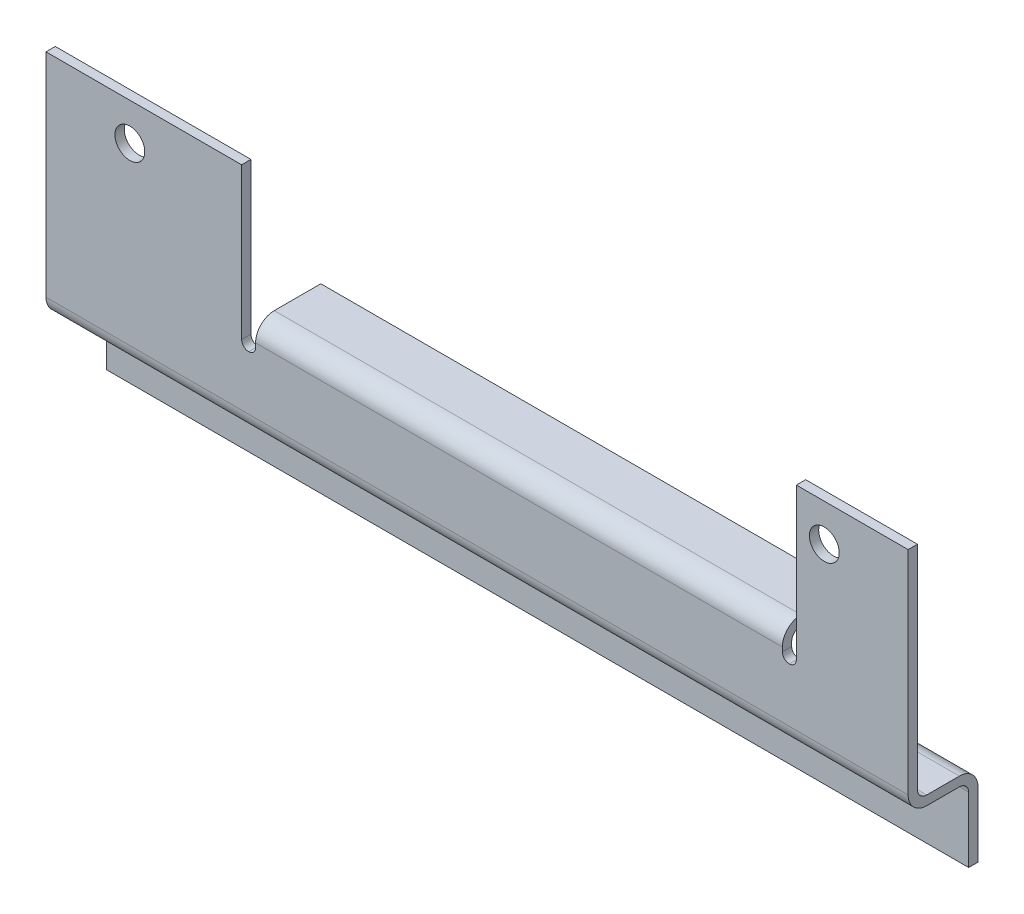
ISO-10303-21;
HEADER;
FILE_DESCRIPTION(('STEP AP214'),'2;1');
FILE_NAME('part.step','',(''),(''),'','','');
FILE_SCHEMA(('AUTOMOTIVE_DESIGN { 1 0 10303 214 1 1 1 1 }'));
ENDSEC;
DATA;
#1=APPLICATION_CONTEXT('core data for automotive mechanical design processes');
#2=APPLICATION_PROTOCOL_DEFINITION('international standard','automotive_design',2000,#1);
#3=PRODUCT_CONTEXT('',#1,'mechanical');
#4=PRODUCT('Part','Part','',(#3));
#5=PRODUCT_RELATED_PRODUCT_CATEGORY('part','',(#4));
#6=PRODUCT_DEFINITION_FORMATION('','',#4);
#7=PRODUCT_DEFINITION_CONTEXT('part definition',#1,'design');
#8=PRODUCT_DEFINITION('design','',#6,#7);
#9=PRODUCT_DEFINITION_SHAPE('','',#8);
#10=(LENGTH_UNIT() NAMED_UNIT(*) SI_UNIT(.MILLI.,.METRE.));
#11=(NAMED_UNIT(*) PLANE_ANGLE_UNIT() SI_UNIT($,.RADIAN.));
#12=(NAMED_UNIT(*) SI_UNIT($,.STERADIAN.) SOLID_ANGLE_UNIT());
#13=UNCERTAINTY_MEASURE_WITH_UNIT(LENGTH_MEASURE(1.E-05),#10,'distance_accuracy_value','');
#14=(GEOMETRIC_REPRESENTATION_CONTEXT(3) GLOBAL_UNCERTAINTY_ASSIGNED_CONTEXT((#13)) GLOBAL_UNIT_ASSIGNED_CONTEXT((#10,
#11,#12)) REPRESENTATION_CONTEXT('',''));
#15=CARTESIAN_POINT('',(0.,0.,0.));
#16=DIRECTION('',(0.,0.,1.));
#17=DIRECTION('',(1.,0.,0.));
#18=AXIS2_PLACEMENT_3D('',#15,#16,#17);
#19=CARTESIAN_POINT('',(46.275,-25.41,1.));
#20=DIRECTION('',(0.,0.,-1.));
#21=DIRECTION('',(-1.,0.,0.));
#22=AXIS2_PLACEMENT_3D('',#19,#20,#21);
#23=PLANE('',#22);
#24=DIRECTION('',(0.,-1.,0.));
#25=VECTOR('',#24,1.);
#26=CARTESIAN_POINT('',(34.275,-25.41,1.));
#27=LINE('',#26,#25);
#28=CARTESIAN_POINT('',(34.275,-25.41,1.));
#29=VERTEX_POINT('',#28);
#30=CARTESIAN_POINT('',(34.275,-41.66,1.));
#31=VERTEX_POINT('',#30);
#32=EDGE_CURVE('E288',#29,#31,#27,.T.);
#33=ORIENTED_EDGE('',*,*,#32,.T.);
#34=CARTESIAN_POINT('',(33.525,-41.66,1.));
#35=DIRECTION('',(0.,0.,-1.));
#36=DIRECTION('',(-1.,0.,0.));
#37=AXIS2_PLACEMENT_3D('',#34,#35,#36);
#38=CIRCLE('',#37,0.75);
#39=CARTESIAN_POINT('',(33.525,-42.41,1.));
#40=VERTEX_POINT('',#39);
#41=EDGE_CURVE('E40',#31,#40,#38,.T.);
#42=ORIENTED_EDGE('',*,*,#41,.T.);
#43=DIRECTION('',(1.,0.,0.));
#44=VECTOR('',#43,1.);
#45=CARTESIAN_POINT('',(32.775,-42.41,1.));
#46=LINE('',#45,#44);
#47=CARTESIAN_POINT('',(33.515,-42.41,1.));
#48=VERTEX_POINT('',#47);
#49=EDGE_CURVE('E236',#48,#40,#46,.T.);
#50=ORIENTED_EDGE('',*,*,#49,.F.);
#51=CARTESIAN_POINT('',(33.515,-41.67,1.));
#52=DIRECTION('',(0.,0.,-1.));
#53=DIRECTION('',(-1.,0.,0.));
#54=AXIS2_PLACEMENT_3D('',#51,#52,#53);
#55=CIRCLE('',#54,0.74);
#56=CARTESIAN_POINT('',(32.775,-41.67,1.));
#57=VERTEX_POINT('',#56);
#58=EDGE_CURVE('E235',#48,#57,#55,.T.);
#59=ORIENTED_EDGE('',*,*,#58,.T.);
#60=DIRECTION('',(0.,-1.,0.));
#61=VECTOR('',#60,1.);
#62=CARTESIAN_POINT('',(32.775,-25.41,1.));
#63=LINE('',#62,#61);
#64=CARTESIAN_POINT('',(32.775,-41.22,1.));
#65=VERTEX_POINT('',#64);
#66=EDGE_CURVE('E219',#65,#57,#63,.T.);
#67=ORIENTED_EDGE('',*,*,#66,.F.);
#68=DIRECTION('',(-1.,0.,0.));
#69=VECTOR('',#68,1.);
#70=CARTESIAN_POINT('',(46.275,-41.22,1.));
#71=LINE('',#70,#69);
#72=CARTESIAN_POINT('',(-23.775,-41.22,1.));
#73=VERTEX_POINT('',#72);
#74=EDGE_CURVE('E233',#65,#73,#71,.T.);
#75=ORIENTED_EDGE('',*,*,#74,.T.);
#76=DIRECTION('',(0.,1.,0.));
#77=VECTOR('',#76,1.);
#78=CARTESIAN_POINT('',(-23.775,-25.41,1.));
#79=LINE('',#78,#77);
#80=CARTESIAN_POINT('',(-23.775,-41.67,1.));
#81=VERTEX_POINT('',#80);
#82=EDGE_CURVE('E570',#81,#73,#79,.T.);
#83=ORIENTED_EDGE('',*,*,#82,.F.);
#84=CARTESIAN_POINT('',(-24.515,-41.67,1.));
#85=DIRECTION('',(0.,0.,-1.));
#86=DIRECTION('',(-1.,0.,0.));
#87=AXIS2_PLACEMENT_3D('',#84,#85,#86);
#88=CIRCLE('',#87,0.74);
#89=CARTESIAN_POINT('',(-24.515,-42.41,1.));
#90=VERTEX_POINT('',#89);
#91=EDGE_CURVE('E267',#81,#90,#88,.T.);
#92=ORIENTED_EDGE('',*,*,#91,.T.);
#93=DIRECTION('',(1.,0.,0.));
#94=VECTOR('',#93,1.);
#95=CARTESIAN_POINT('',(-25.275,-42.41,1.));
#96=LINE('',#95,#94);
#97=CARTESIAN_POINT('',(-24.525,-42.41,1.));
#98=VERTEX_POINT('',#97);
#99=EDGE_CURVE('E566',#98,#90,#96,.T.);
#100=ORIENTED_EDGE('',*,*,#99,.F.);
#101=CARTESIAN_POINT('',(-24.525,-41.66,1.));
#102=DIRECTION('',(0.,0.,-1.));
#103=DIRECTION('',(-1.,0.,0.));
#104=AXIS2_PLACEMENT_3D('',#101,#102,#103);
#105=CIRCLE('',#104,0.75);
#106=CARTESIAN_POINT('',(-25.275,-41.66,1.));
#107=VERTEX_POINT('',#106);
#108=EDGE_CURVE('E257',#98,#107,#105,.T.);
#109=ORIENTED_EDGE('',*,*,#108,.T.);
#110=DIRECTION('',(0.,1.,0.));
#111=VECTOR('',#110,1.);
#112=CARTESIAN_POINT('',(-25.275,-25.41,1.));
#113=LINE('',#112,#111);
#114=CARTESIAN_POINT('',(-25.275,-25.41,1.));
#115=VERTEX_POINT('',#114);
#116=EDGE_CURVE('E296',#107,#115,#113,.T.);
#117=ORIENTED_EDGE('',*,*,#116,.T.);
#118=DIRECTION('',(-1.,0.,0.));
#119=VECTOR('',#118,1.);
#120=CARTESIAN_POINT('',(-46.275,-25.41,1.));
#121=LINE('',#120,#119);
#122=CARTESIAN_POINT('',(-46.275,-25.41,1.));
#123=VERTEX_POINT('',#122);
#124=EDGE_CURVE('E298',#115,#123,#121,.T.);
#125=ORIENTED_EDGE('',*,*,#124,.T.);
#126=DIRECTION('',(0.,-1.,0.));
#127=VECTOR('',#126,1.);
#128=CARTESIAN_POINT('',(-46.275,-25.41,1.));
#129=LINE('',#128,#127);
#130=CARTESIAN_POINT('',(-46.275,-48.22,1.));
#131=VERTEX_POINT('',#130);
#132=EDGE_CURVE('E305',#123,#131,#129,.T.);
#133=ORIENTED_EDGE('',*,*,#132,.T.);
#134=DIRECTION('',(1.,0.,0.));
#135=VECTOR('',#134,1.);
#136=CARTESIAN_POINT('',(46.275,-48.22,1.));
#137=LINE('',#136,#135);
#138=CARTESIAN_POINT('',(46.275,-48.22,1.));
#139=VERTEX_POINT('',#138);
#140=EDGE_CURVE('E424',#131,#139,#137,.T.);
#141=ORIENTED_EDGE('',*,*,#140,.T.);
#142=DIRECTION('',(0.,1.,0.));
#143=VECTOR('',#142,1.);
#144=CARTESIAN_POINT('',(46.275,-25.41,1.));
#145=LINE('',#144,#143);
#146=CARTESIAN_POINT('',(46.275,-25.41,1.));
#147=VERTEX_POINT('',#146);
#148=EDGE_CURVE('E308',#139,#147,#145,.T.);
#149=ORIENTED_EDGE('',*,*,#148,.T.);
#150=DIRECTION('',(-1.,0.,0.));
#151=VECTOR('',#150,1.);
#152=CARTESIAN_POINT('',(34.275,-25.41,1.));
#153=LINE('',#152,#151);
#154=EDGE_CURVE('E294',#147,#29,#153,.T.);
#155=ORIENTED_EDGE('',*,*,#154,.T.);
#156=EDGE_LOOP('',(#33,#42,#50,#59,#67,#75,#83,#92,#100,#109,#117,#125,#133,#141,#149,#155));
#157=FACE_BOUND('',#156,.T.);
#158=CARTESIAN_POINT('',(37.275,-29.41,1.));
#159=DIRECTION('',(0.,0.,1.));
#160=DIRECTION('',(1.,0.,0.));
#161=AXIS2_PLACEMENT_3D('',#158,#159,#160);
#162=CIRCLE('',#161,1.6);
#163=CARTESIAN_POINT('',(38.875,-29.41,1.));
#164=VERTEX_POINT('',#163);
#165=EDGE_CURVE('E487',#164,#164,#162,.T.);
#166=ORIENTED_EDGE('',*,*,#165,.F.);
#167=EDGE_LOOP('',(#166));
#168=FACE_BOUND('',#167,.T.);
#169=CARTESIAN_POINT('',(-37.275,-29.41,1.));
#170=DIRECTION('',(0.,0.,1.));
#171=DIRECTION('',(1.,0.,0.));
#172=AXIS2_PLACEMENT_3D('',#169,#170,#171);
#173=CIRCLE('',#172,1.6);
#174=CARTESIAN_POINT('',(-35.675,-29.41,1.));
#175=VERTEX_POINT('',#174);
#176=EDGE_CURVE('E589',#175,#175,#173,.T.);
#177=ORIENTED_EDGE('',*,*,#176,.F.);
#178=EDGE_LOOP('',(#177));
#179=FACE_BOUND('',#178,.T.);
#180=ADVANCED_FACE('F32',(#157,#168,#179),#23,.F.);
#181=CARTESIAN_POINT('',(46.275,-25.41,0.));
#182=DIRECTION('',(0.,0.,-1.));
#183=DIRECTION('',(-1.,0.,0.));
#184=AXIS2_PLACEMENT_3D('',#181,#182,#183);
#185=PLANE('',#184);
#186=DIRECTION('',(-1.,0.,0.));
#187=VECTOR('',#186,1.);
#188=CARTESIAN_POINT('',(46.275,-42.41,0.));
#189=LINE('',#188,#187);
#190=CARTESIAN_POINT('',(33.525,-42.41,0.));
#191=VERTEX_POINT('',#190);
#192=CARTESIAN_POINT('',(33.515,-42.41,0.));
#193=VERTEX_POINT('',#192);
#194=EDGE_CURVE('E227',#191,#193,#189,.T.);
#195=ORIENTED_EDGE('',*,*,#194,.F.);
#196=CARTESIAN_POINT('',(33.525,-41.66,0.));
#197=DIRECTION('',(0.,0.,-1.));
#198=DIRECTION('',(-1.,0.,0.));
#199=AXIS2_PLACEMENT_3D('',#196,#197,#198);
#200=CIRCLE('',#199,0.75);
#201=CARTESIAN_POINT('',(34.275,-41.66,0.));
#202=VERTEX_POINT('',#201);
#203=EDGE_CURVE('E11',#191,#202,#200,.F.);
#204=ORIENTED_EDGE('',*,*,#203,.T.);
#205=DIRECTION('',(0.,-1.,0.));
#206=VECTOR('',#205,1.);
#207=CARTESIAN_POINT('',(34.275,-25.41,0.));
#208=LINE('',#207,#206);
#209=CARTESIAN_POINT('',(34.275,-25.41,0.));
#210=VERTEX_POINT('',#209);
#211=EDGE_CURVE('E290',#210,#202,#208,.T.);
#212=ORIENTED_EDGE('',*,*,#211,.F.);
#213=DIRECTION('',(-1.,0.,0.));
#214=VECTOR('',#213,1.);
#215=CARTESIAN_POINT('',(34.275,-25.41,0.));
#216=LINE('',#215,#214);
#217=CARTESIAN_POINT('',(46.275,-25.41,0.));
#218=VERTEX_POINT('',#217);
#219=EDGE_CURVE('E485',#218,#210,#216,.T.);
#220=ORIENTED_EDGE('',*,*,#219,.F.);
#221=DIRECTION('',(0.,1.,0.));
#222=VECTOR('',#221,1.);
#223=CARTESIAN_POINT('',(46.275,-25.41,0.));
#224=LINE('',#223,#222);
#225=CARTESIAN_POINT('',(46.275,-48.22,0.));
#226=VERTEX_POINT('',#225);
#227=EDGE_CURVE('E300',#226,#218,#224,.T.);
#228=ORIENTED_EDGE('',*,*,#227,.F.);
#229=DIRECTION('',(1.,0.,0.));
#230=VECTOR('',#229,1.);
#231=CARTESIAN_POINT('',(-46.275,-48.22,0.));
#232=LINE('',#231,#230);
#233=CARTESIAN_POINT('',(-46.275,-48.22,0.));
#234=VERTEX_POINT('',#233);
#235=EDGE_CURVE('E331',#226,#234,#232,.F.);
#236=ORIENTED_EDGE('',*,*,#235,.T.);
#237=DIRECTION('',(0.,-1.,0.));
#238=VECTOR('',#237,1.);
#239=CARTESIAN_POINT('',(-46.275,-25.41,0.));
#240=LINE('',#239,#238);
#241=CARTESIAN_POINT('',(-46.275,-25.41,0.));
#242=VERTEX_POINT('',#241);
#243=EDGE_CURVE('E324',#242,#234,#240,.T.);
#244=ORIENTED_EDGE('',*,*,#243,.F.);
#245=DIRECTION('',(-1.,0.,0.));
#246=VECTOR('',#245,1.);
#247=CARTESIAN_POINT('',(-46.275,-25.41,0.));
#248=LINE('',#247,#246);
#249=CARTESIAN_POINT('',(-25.275,-25.41,0.));
#250=VERTEX_POINT('',#249);
#251=EDGE_CURVE('E496',#250,#242,#248,.T.);
#252=ORIENTED_EDGE('',*,*,#251,.F.);
#253=DIRECTION('',(0.,1.,0.));
#254=VECTOR('',#253,1.);
#255=CARTESIAN_POINT('',(-25.275,-25.41,0.));
#256=LINE('',#255,#254);
#257=CARTESIAN_POINT('',(-25.275,-41.66,0.));
#258=VERTEX_POINT('',#257);
#259=EDGE_CURVE('E489',#258,#250,#256,.T.);
#260=ORIENTED_EDGE('',*,*,#259,.F.);
#261=CARTESIAN_POINT('',(-24.525,-41.66,0.));
#262=DIRECTION('',(0.,0.,-1.));
#263=DIRECTION('',(-1.,0.,0.));
#264=AXIS2_PLACEMENT_3D('',#261,#262,#263);
#265=CIRCLE('',#264,0.75);
#266=CARTESIAN_POINT('',(-24.525,-42.41,0.));
#267=VERTEX_POINT('',#266);
#268=EDGE_CURVE('E259',#258,#267,#265,.F.);
#269=ORIENTED_EDGE('',*,*,#268,.T.);
#270=DIRECTION('',(-1.,0.,0.));
#271=VECTOR('',#270,1.);
#272=CARTESIAN_POINT('',(46.275,-42.41,0.));
#273=LINE('',#272,#271);
#274=CARTESIAN_POINT('',(-24.515,-42.41,0.));
#275=VERTEX_POINT('',#274);
#276=EDGE_CURVE('E228',#275,#267,#273,.T.);
#277=ORIENTED_EDGE('',*,*,#276,.F.);
#278=CARTESIAN_POINT('',(-24.515,-41.67,0.));
#279=DIRECTION('',(0.,0.,-1.));
#280=DIRECTION('',(-1.,0.,0.));
#281=AXIS2_PLACEMENT_3D('',#278,#279,#280);
#282=CIRCLE('',#281,0.74);
#283=CARTESIAN_POINT('',(-23.775,-41.67,0.));
#284=VERTEX_POINT('',#283);
#285=EDGE_CURVE('E269',#275,#284,#282,.F.);
#286=ORIENTED_EDGE('',*,*,#285,.T.);
#287=DIRECTION('',(0.,-1.,0.));
#288=VECTOR('',#287,1.);
#289=CARTESIAN_POINT('',(-23.775,-25.41,0.));
#290=LINE('',#289,#288);
#291=CARTESIAN_POINT('',(-23.775,-41.22,0.));
#292=VERTEX_POINT('',#291);
#293=EDGE_CURVE('E457',#292,#284,#290,.T.);
#294=ORIENTED_EDGE('',*,*,#293,.F.);
#295=DIRECTION('',(-1.,0.,0.));
#296=VECTOR('',#295,1.);
#297=CARTESIAN_POINT('',(34.275,-41.22,0.));
#298=LINE('',#297,#296);
#299=CARTESIAN_POINT('',(32.775,-41.22,0.));
#300=VERTEX_POINT('',#299);
#301=EDGE_CURVE('E241',#292,#300,#298,.F.);
#302=ORIENTED_EDGE('',*,*,#301,.T.);
#303=DIRECTION('',(0.,1.,0.));
#304=VECTOR('',#303,1.);
#305=CARTESIAN_POINT('',(32.775,-25.41,0.));
#306=LINE('',#305,#304);
#307=CARTESIAN_POINT('',(32.775,-41.67,0.));
#308=VERTEX_POINT('',#307);
#309=EDGE_CURVE('E565',#308,#300,#306,.T.);
#310=ORIENTED_EDGE('',*,*,#309,.F.);
#311=CARTESIAN_POINT('',(33.515,-41.67,0.));
#312=DIRECTION('',(0.,0.,-1.));
#313=DIRECTION('',(-1.,0.,0.));
#314=AXIS2_PLACEMENT_3D('',#311,#312,#313);
#315=CIRCLE('',#314,0.74);
#316=EDGE_CURVE('E277',#308,#193,#315,.F.);
#317=ORIENTED_EDGE('',*,*,#316,.T.);
#318=EDGE_LOOP('',(#195,#204,#212,#220,#228,#236,#244,#252,#260,#269,#277,#286,#294,#302,#310,#317));
#319=FACE_BOUND('',#318,.T.);
#320=CARTESIAN_POINT('',(37.275,-29.41,0.));
#321=DIRECTION('',(0.,0.,1.));
#322=DIRECTION('',(1.,0.,0.));
#323=AXIS2_PLACEMENT_3D('',#320,#321,#322);
#324=CIRCLE('',#323,1.6);
#325=CARTESIAN_POINT('',(38.875,-29.41,0.));
#326=VERTEX_POINT('',#325);
#327=EDGE_CURVE('E492',#326,#326,#324,.T.);
#328=ORIENTED_EDGE('',*,*,#327,.T.);
#329=EDGE_LOOP('',(#328));
#330=FACE_BOUND('',#329,.T.);
#331=CARTESIAN_POINT('',(-37.275,-29.41,0.));
#332=DIRECTION('',(0.,0.,1.));
#333=DIRECTION('',(1.,0.,0.));
#334=AXIS2_PLACEMENT_3D('',#331,#332,#333);
#335=CIRCLE('',#334,1.6);
#336=CARTESIAN_POINT('',(-35.675,-29.41,0.));
#337=VERTEX_POINT('',#336);
#338=EDGE_CURVE('E584',#337,#337,#335,.T.);
#339=ORIENTED_EDGE('',*,*,#338,.T.);
#340=EDGE_LOOP('',(#339));
#341=FACE_BOUND('',#340,.T.);
#342=ADVANCED_FACE('F482',(#319,#330,#341),#185,.T.);
#343=CARTESIAN_POINT('',(34.275,-25.41,1.));
#344=DIRECTION('',(0.,-1.,0.));
#345=DIRECTION('',(0.,0.,-1.));
#346=AXIS2_PLACEMENT_3D('',#343,#344,#345);
#347=PLANE('',#346);
#348=ORIENTED_EDGE('',*,*,#219,.T.);
#349=DIRECTION('',(0.,0.,-1.));
#350=VECTOR('',#349,1.);
#351=CARTESIAN_POINT('',(34.275,-25.41,1.));
#352=LINE('',#351,#350);
#353=EDGE_CURVE('E319',#29,#210,#352,.T.);
#354=ORIENTED_EDGE('',*,*,#353,.F.);
#355=ORIENTED_EDGE('',*,*,#154,.F.);
#356=DIRECTION('',(0.,0.,-1.));
#357=VECTOR('',#356,1.);
#358=CARTESIAN_POINT('',(46.275,-25.41,1.));
#359=LINE('',#358,#357);
#360=EDGE_CURVE('E310',#147,#218,#359,.T.);
#361=ORIENTED_EDGE('',*,*,#360,.T.);
#362=EDGE_LOOP('',(#348,#354,#355,#361));
#363=FACE_BOUND('',#362,.T.);
#364=ADVANCED_FACE('F526',(#363),#347,.F.);
#365=CARTESIAN_POINT('',(34.275,-25.41,1.));
#366=DIRECTION('',(1.,0.,0.));
#367=DIRECTION('',(0.,1.,0.));
#368=AXIS2_PLACEMENT_3D('',#365,#366,#367);
#369=PLANE('',#368);
#370=ORIENTED_EDGE('',*,*,#211,.T.);
#371=DIRECTION('',(0.,0.,1.));
#372=VECTOR('',#371,1.);
#373=CARTESIAN_POINT('',(34.275,-41.66,1.));
#374=LINE('',#373,#372);
#375=EDGE_CURVE('E280',#202,#31,#374,.T.);
#376=ORIENTED_EDGE('',*,*,#375,.T.);
#377=ORIENTED_EDGE('',*,*,#32,.F.);
#378=ORIENTED_EDGE('',*,*,#353,.T.);
#379=EDGE_LOOP('',(#370,#376,#377,#378));
#380=FACE_BOUND('',#379,.T.);
#381=ADVANCED_FACE('F286',(#380),#369,.F.);
#382=CARTESIAN_POINT('',(-25.275,-39.22,1.));
#383=DIRECTION('',(0.,-1.,0.));
#384=DIRECTION('',(0.,0.,-1.));
#385=AXIS2_PLACEMENT_3D('',#382,#383,#384);
#386=PLANE('',#385);
#387=DIRECTION('',(-1.,0.,0.));
#388=VECTOR('',#387,1.);
#389=CARTESIAN_POINT('',(-25.275,-39.22,-1.));
#390=LINE('',#389,#388);
#391=CARTESIAN_POINT('',(-23.775,-39.22,-1.));
#392=VERTEX_POINT('',#391);
#393=CARTESIAN_POINT('',(32.775,-39.22,-1.));
#394=VERTEX_POINT('',#393);
#395=EDGE_CURVE('E240',#392,#394,#390,.F.);
#396=ORIENTED_EDGE('',*,*,#395,.T.);
#397=DIRECTION('',(0.,0.,-1.));
#398=VECTOR('',#397,1.);
#399=CARTESIAN_POINT('',(32.775,-39.22,1.));
#400=LINE('',#399,#398);
#401=CARTESIAN_POINT('',(32.775,-39.22,-6.));
#402=VERTEX_POINT('',#401);
#403=EDGE_CURVE('E222',#394,#402,#400,.T.);
#404=ORIENTED_EDGE('',*,*,#403,.T.);
#405=DIRECTION('',(-1.,0.,0.));
#406=VECTOR('',#405,1.);
#407=CARTESIAN_POINT('',(-25.275,-39.22,-6.));
#408=LINE('',#407,#406);
#409=CARTESIAN_POINT('',(-23.775,-39.22,-6.));
#410=VERTEX_POINT('',#409);
#411=EDGE_CURVE('E582',#402,#410,#408,.T.);
#412=ORIENTED_EDGE('',*,*,#411,.T.);
#413=DIRECTION('',(0.,0.,1.));
#414=VECTOR('',#413,1.);
#415=CARTESIAN_POINT('',(-23.775,-39.22,1.));
#416=LINE('',#415,#414);
#417=EDGE_CURVE('E576',#410,#392,#416,.T.);
#418=ORIENTED_EDGE('',*,*,#417,.T.);
#419=EDGE_LOOP('',(#396,#404,#412,#418));
#420=FACE_BOUND('',#419,.T.);
#421=ADVANCED_FACE('F540',(#420),#386,.F.);
#422=CARTESIAN_POINT('',(-25.275,-25.41,1.));
#423=DIRECTION('',(-1.,0.,0.));
#424=DIRECTION('',(0.,-1.,0.));
#425=AXIS2_PLACEMENT_3D('',#422,#423,#424);
#426=PLANE('',#425);
#427=ORIENTED_EDGE('',*,*,#116,.F.);
#428=DIRECTION('',(0.,0.,1.));
#429=VECTOR('',#428,1.);
#430=CARTESIAN_POINT('',(-25.275,-41.66,0.));
#431=LINE('',#430,#429);
#432=EDGE_CURVE('E255',#107,#258,#431,.F.);
#433=ORIENTED_EDGE('',*,*,#432,.T.);
#434=ORIENTED_EDGE('',*,*,#259,.T.);
#435=DIRECTION('',(0.,0.,-1.));
#436=VECTOR('',#435,1.);
#437=CARTESIAN_POINT('',(-25.275,-25.41,1.));
#438=LINE('',#437,#436);
#439=EDGE_CURVE('E316',#115,#250,#438,.T.);
#440=ORIENTED_EDGE('',*,*,#439,.F.);
#441=EDGE_LOOP('',(#427,#433,#434,#440));
#442=FACE_BOUND('',#441,.T.);
#443=ADVANCED_FACE('F537',(#442),#426,.F.);
#444=CARTESIAN_POINT('',(-46.275,-25.41,1.));
#445=DIRECTION('',(0.,-1.,0.));
#446=DIRECTION('',(0.,0.,-1.));
#447=AXIS2_PLACEMENT_3D('',#444,#445,#446);
#448=PLANE('',#447);
#449=ORIENTED_EDGE('',*,*,#251,.T.);
#450=DIRECTION('',(0.,0.,-1.));
#451=VECTOR('',#450,1.);
#452=CARTESIAN_POINT('',(-46.275,-25.41,1.));
#453=LINE('',#452,#451);
#454=EDGE_CURVE('E313',#123,#242,#453,.T.);
#455=ORIENTED_EDGE('',*,*,#454,.F.);
#456=ORIENTED_EDGE('',*,*,#124,.F.);
#457=ORIENTED_EDGE('',*,*,#439,.T.);
#458=EDGE_LOOP('',(#449,#455,#456,#457));
#459=FACE_BOUND('',#458,.T.);
#460=ADVANCED_FACE('F500',(#459),#448,.F.);
#461=CARTESIAN_POINT('',(-46.275,-25.41,1.));
#462=DIRECTION('',(1.,0.,0.));
#463=DIRECTION('',(0.,0.,-1.));
#464=AXIS2_PLACEMENT_3D('',#461,#462,#463);
#465=PLANE('',#464);
#466=DIRECTION('',(0.,0.,1.));
#467=VECTOR('',#466,1.);
#468=CARTESIAN_POINT('',(-46.275,-49.22,-6.5));
#469=LINE('',#468,#467);
#470=CARTESIAN_POINT('',(-46.275,-49.22,-4.5));
#471=VERTEX_POINT('',#470);
#472=CARTESIAN_POINT('',(-46.275,-49.22,-1.));
#473=VERTEX_POINT('',#472);
#474=EDGE_CURVE('E343',#471,#473,#469,.T.);
#475=ORIENTED_EDGE('',*,*,#474,.F.);
#476=CARTESIAN_POINT('',(-46.275,-51.22,-4.5));
#477=DIRECTION('',(1.,0.,0.));
#478=DIRECTION('',(0.,0.,-1.));
#479=AXIS2_PLACEMENT_3D('',#476,#477,#478);
#480=CIRCLE('',#479,2.);
#481=CARTESIAN_POINT('',(-46.275,-51.22,-6.5));
#482=VERTEX_POINT('',#481);
#483=EDGE_CURVE('E464',#471,#482,#480,.F.);
#484=ORIENTED_EDGE('',*,*,#483,.T.);
#485=DIRECTION('',(0.,-1.,0.));
#486=VECTOR('',#485,1.);
#487=CARTESIAN_POINT('',(-46.275,-49.22,-6.5));
#488=LINE('',#487,#486);
#489=CARTESIAN_POINT('',(-46.275,-58.22,-6.5));
#490=VERTEX_POINT('',#489);
#491=EDGE_CURVE('E395',#482,#490,#488,.T.);
#492=ORIENTED_EDGE('',*,*,#491,.T.);
#493=DIRECTION('',(0.,0.,-1.));
#494=VECTOR('',#493,1.);
#495=CARTESIAN_POINT('',(-46.275,-58.22,-6.5));
#496=LINE('',#495,#494);
#497=CARTESIAN_POINT('',(-46.275,-58.22,-5.5));
#498=VERTEX_POINT('',#497);
#499=EDGE_CURVE('E392',#498,#490,#496,.T.);
#500=ORIENTED_EDGE('',*,*,#499,.F.);
#501=DIRECTION('',(0.,1.,0.));
#502=VECTOR('',#501,1.);
#503=CARTESIAN_POINT('',(-46.275,-58.22,-5.5));
#504=LINE('',#503,#502);
#505=CARTESIAN_POINT('',(-46.275,-51.22,-5.5));
#506=VERTEX_POINT('',#505);
#507=EDGE_CURVE('E382',#498,#506,#504,.T.);
#508=ORIENTED_EDGE('',*,*,#507,.T.);
#509=CARTESIAN_POINT('',(-46.275,-51.22,-4.5));
#510=DIRECTION('',(1.,0.,0.));
#511=DIRECTION('',(0.,0.,-1.));
#512=AXIS2_PLACEMENT_3D('',#509,#510,#511);
#513=CIRCLE('',#512,1.);
#514=CARTESIAN_POINT('',(-46.275,-50.22,-4.5));
#515=VERTEX_POINT('',#514);
#516=EDGE_CURVE('E333',#506,#515,#513,.T.);
#517=ORIENTED_EDGE('',*,*,#516,.T.);
#518=DIRECTION('',(0.,0.,1.));
#519=VECTOR('',#518,1.);
#520=CARTESIAN_POINT('',(-46.275,-50.22,-6.5));
#521=LINE('',#520,#519);
#522=CARTESIAN_POINT('',(-46.275,-50.22,-1.));
#523=VERTEX_POINT('',#522);
#524=EDGE_CURVE('E365',#515,#523,#521,.T.);
#525=ORIENTED_EDGE('',*,*,#524,.T.);
#526=CARTESIAN_POINT('',(-46.275,-48.22,-1.));
#527=DIRECTION('',(1.,0.,0.));
#528=DIRECTION('',(0.,0.,-1.));
#529=AXIS2_PLACEMENT_3D('',#526,#527,#528);
#530=CIRCLE('',#529,2.);
#531=EDGE_CURVE('E465',#523,#131,#530,.F.);
#532=ORIENTED_EDGE('',*,*,#531,.T.);
#533=ORIENTED_EDGE('',*,*,#132,.F.);
#534=ORIENTED_EDGE('',*,*,#454,.T.);
#535=ORIENTED_EDGE('',*,*,#243,.T.);
#536=CARTESIAN_POINT('',(-46.275,-48.22,-1.));
#537=DIRECTION('',(1.,0.,0.));
#538=DIRECTION('',(0.,0.,-1.));
#539=AXIS2_PLACEMENT_3D('',#536,#537,#538);
#540=CIRCLE('',#539,1.);
#541=EDGE_CURVE('E339',#234,#473,#540,.T.);
#542=ORIENTED_EDGE('',*,*,#541,.T.);
#543=EDGE_LOOP('',(#475,#484,#492,#500,#508,#517,#525,#532,#533,#534,#535,#542));
#544=FACE_BOUND('',#543,.T.);
#545=ADVANCED_FACE('F390',(#544),#465,.F.);
#546=CARTESIAN_POINT('',(46.275,-25.41,1.));
#547=DIRECTION('',(-1.,0.,0.));
#548=DIRECTION('',(0.,0.,1.));
#549=AXIS2_PLACEMENT_3D('',#546,#547,#548);
#550=PLANE('',#549);
#551=DIRECTION('',(0.,1.,0.));
#552=VECTOR('',#551,1.);
#553=CARTESIAN_POINT('',(46.275,-49.22,-6.5));
#554=LINE('',#553,#552);
#555=CARTESIAN_POINT('',(46.275,-58.22,-6.5));
#556=VERTEX_POINT('',#555);
#557=CARTESIAN_POINT('',(46.275,-51.22,-6.5));
#558=VERTEX_POINT('',#557);
#559=EDGE_CURVE('E352',#556,#558,#554,.T.);
#560=ORIENTED_EDGE('',*,*,#559,.T.);
#561=CARTESIAN_POINT('',(46.275,-51.22,-4.5));
#562=DIRECTION('',(-1.,0.,0.));
#563=DIRECTION('',(0.,0.,1.));
#564=AXIS2_PLACEMENT_3D('',#561,#562,#563);
#565=CIRCLE('',#564,2.);
#566=CARTESIAN_POINT('',(46.275,-49.22,-4.5));
#567=VERTEX_POINT('',#566);
#568=EDGE_CURVE('E414',#558,#567,#565,.F.);
#569=ORIENTED_EDGE('',*,*,#568,.T.);
#570=DIRECTION('',(0.,0.,1.));
#571=VECTOR('',#570,1.);
#572=CARTESIAN_POINT('',(46.275,-49.22,-6.5));
#573=LINE('',#572,#571);
#574=CARTESIAN_POINT('',(46.275,-49.22,-1.));
#575=VERTEX_POINT('',#574);
#576=EDGE_CURVE('E347',#567,#575,#573,.T.);
#577=ORIENTED_EDGE('',*,*,#576,.T.);
#578=CARTESIAN_POINT('',(46.275,-48.22,-1.));
#579=DIRECTION('',(-1.,0.,0.));
#580=DIRECTION('',(0.,0.,1.));
#581=AXIS2_PLACEMENT_3D('',#578,#579,#580);
#582=CIRCLE('',#581,1.);
#583=EDGE_CURVE('E337',#575,#226,#582,.T.);
#584=ORIENTED_EDGE('',*,*,#583,.T.);
#585=ORIENTED_EDGE('',*,*,#227,.T.);
#586=ORIENTED_EDGE('',*,*,#360,.F.);
#587=ORIENTED_EDGE('',*,*,#148,.F.);
#588=CARTESIAN_POINT('',(46.275,-48.22,-1.));
#589=DIRECTION('',(-1.,0.,0.));
#590=DIRECTION('',(0.,0.,1.));
#591=AXIS2_PLACEMENT_3D('',#588,#589,#590);
#592=CIRCLE('',#591,2.);
#593=CARTESIAN_POINT('',(46.275,-50.22,-1.));
#594=VERTEX_POINT('',#593);
#595=EDGE_CURVE('E425',#139,#594,#592,.F.);
#596=ORIENTED_EDGE('',*,*,#595,.T.);
#597=DIRECTION('',(0.,0.,1.));
#598=VECTOR('',#597,1.);
#599=CARTESIAN_POINT('',(46.275,-50.22,-6.5));
#600=LINE('',#599,#598);
#601=CARTESIAN_POINT('',(46.275,-50.22,-4.5));
#602=VERTEX_POINT('',#601);
#603=EDGE_CURVE('E361',#602,#594,#600,.T.);
#604=ORIENTED_EDGE('',*,*,#603,.F.);
#605=CARTESIAN_POINT('',(46.275,-51.22,-4.5));
#606=DIRECTION('',(-1.,0.,0.));
#607=DIRECTION('',(0.,0.,1.));
#608=AXIS2_PLACEMENT_3D('',#605,#606,#607);
#609=CIRCLE('',#608,1.);
#610=CARTESIAN_POINT('',(46.275,-51.22,-5.5));
#611=VERTEX_POINT('',#610);
#612=EDGE_CURVE('E335',#602,#611,#609,.T.);
#613=ORIENTED_EDGE('',*,*,#612,.T.);
#614=DIRECTION('',(0.,1.,0.));
#615=VECTOR('',#614,1.);
#616=CARTESIAN_POINT('',(46.275,-58.22,-5.5));
#617=LINE('',#616,#615);
#618=CARTESIAN_POINT('',(46.275,-58.22,-5.5));
#619=VERTEX_POINT('',#618);
#620=EDGE_CURVE('E385',#619,#611,#617,.T.);
#621=ORIENTED_EDGE('',*,*,#620,.F.);
#622=DIRECTION('',(0.,0.,1.));
#623=VECTOR('',#622,1.);
#624=CARTESIAN_POINT('',(46.275,-58.22,-6.5));
#625=LINE('',#624,#623);
#626=EDGE_CURVE('E397',#556,#619,#625,.T.);
#627=ORIENTED_EDGE('',*,*,#626,.F.);
#628=EDGE_LOOP('',(#560,#569,#577,#584,#585,#586,#587,#596,#604,#613,#621,#627));
#629=FACE_BOUND('',#628,.T.);
#630=ADVANCED_FACE('F413',(#629),#550,.F.);
#631=CARTESIAN_POINT('',(37.275,-29.41,1.));
#632=DIRECTION('',(0.,0.,-1.));
#633=DIRECTION('',(-1.,0.,0.));
#634=AXIS2_PLACEMENT_3D('',#631,#632,#633);
#635=CYLINDRICAL_SURFACE('',#634,1.6);
#636=ORIENTED_EDGE('',*,*,#165,.T.);
#637=EDGE_LOOP('',(#636));
#638=FACE_BOUND('',#637,.T.);
#639=ORIENTED_EDGE('',*,*,#327,.F.);
#640=EDGE_LOOP('',(#639));
#641=FACE_BOUND('',#640,.T.);
#642=ADVANCED_FACE('F532',(#638,#641),#635,.F.);
#643=CARTESIAN_POINT('',(-37.275,-29.41,1.));
#644=DIRECTION('',(0.,0.,-1.));
#645=DIRECTION('',(-1.,0.,0.));
#646=AXIS2_PLACEMENT_3D('',#643,#644,#645);
#647=CYLINDRICAL_SURFACE('',#646,1.6);
#648=ORIENTED_EDGE('',*,*,#176,.T.);
#649=EDGE_LOOP('',(#648));
#650=FACE_BOUND('',#649,.T.);
#651=ORIENTED_EDGE('',*,*,#338,.F.);
#652=EDGE_LOOP('',(#651));
#653=FACE_BOUND('',#652,.T.);
#654=ADVANCED_FACE('F596',(#650,#653),#647,.F.);
#655=CARTESIAN_POINT('',(-25.275,-40.22,-6.));
#656=DIRECTION('',(0.,-1.,0.));
#657=DIRECTION('',(0.,0.,-1.));
#658=AXIS2_PLACEMENT_3D('',#655,#656,#657);
#659=PLANE('',#658);
#660=DIRECTION('',(0.,0.,-1.));
#661=VECTOR('',#660,1.);
#662=CARTESIAN_POINT('',(32.775,-40.22,-6.));
#663=LINE('',#662,#661);
#664=CARTESIAN_POINT('',(32.775,-40.22,-1.));
#665=VERTEX_POINT('',#664);
#666=CARTESIAN_POINT('',(32.775,-40.22,-6.));
#667=VERTEX_POINT('',#666);
#668=EDGE_CURVE('E442',#665,#667,#663,.T.);
#669=ORIENTED_EDGE('',*,*,#668,.F.);
#670=DIRECTION('',(-1.,0.,0.));
#671=VECTOR('',#670,1.);
#672=CARTESIAN_POINT('',(-25.275,-40.22,-1.));
#673=LINE('',#672,#671);
#674=CARTESIAN_POINT('',(-23.775,-40.22,-1.));
#675=VERTEX_POINT('',#674);
#676=EDGE_CURVE('E245',#665,#675,#673,.T.);
#677=ORIENTED_EDGE('',*,*,#676,.T.);
#678=DIRECTION('',(0.,0.,1.));
#679=VECTOR('',#678,1.);
#680=CARTESIAN_POINT('',(-23.775,-40.22,-6.));
#681=LINE('',#680,#679);
#682=CARTESIAN_POINT('',(-23.775,-40.22,-6.));
#683=VERTEX_POINT('',#682);
#684=EDGE_CURVE('E440',#683,#675,#681,.T.);
#685=ORIENTED_EDGE('',*,*,#684,.F.);
#686=DIRECTION('',(1.,0.,0.));
#687=VECTOR('',#686,1.);
#688=CARTESIAN_POINT('',(-25.275,-40.22,-6.));
#689=LINE('',#688,#687);
#690=EDGE_CURVE('E346',#683,#667,#689,.T.);
#691=ORIENTED_EDGE('',*,*,#690,.T.);
#692=EDGE_LOOP('',(#669,#677,#685,#691));
#693=FACE_BOUND('',#692,.T.);
#694=ADVANCED_FACE('F438',(#693),#659,.T.);
#695=CARTESIAN_POINT('',(-25.275,-40.22,-6.));
#696=DIRECTION('',(0.,0.,1.));
#697=DIRECTION('',(1.,0.,0.));
#698=AXIS2_PLACEMENT_3D('',#695,#696,#697);
#699=PLANE('',#698);
#700=ORIENTED_EDGE('',*,*,#411,.F.);
#701=DIRECTION('',(0.,-1.,0.));
#702=VECTOR('',#701,1.);
#703=CARTESIAN_POINT('',(32.775,-40.22,-6.));
#704=LINE('',#703,#702);
#705=EDGE_CURVE('E583',#402,#667,#704,.T.);
#706=ORIENTED_EDGE('',*,*,#705,.T.);
#707=ORIENTED_EDGE('',*,*,#690,.F.);
#708=DIRECTION('',(0.,1.,0.));
#709=VECTOR('',#708,1.);
#710=CARTESIAN_POINT('',(-23.775,-40.22,-6.));
#711=LINE('',#710,#709);
#712=EDGE_CURVE('E453',#683,#410,#711,.T.);
#713=ORIENTED_EDGE('',*,*,#712,.T.);
#714=EDGE_LOOP('',(#700,#706,#707,#713));
#715=FACE_BOUND('',#714,.T.);
#716=ADVANCED_FACE('F580',(#715),#699,.F.);
#717=CARTESIAN_POINT('',(-46.275,-49.22,-6.5));
#718=DIRECTION('',(0.,1.,0.));
#719=DIRECTION('',(0.,0.,1.));
#720=AXIS2_PLACEMENT_3D('',#717,#718,#719);
#721=PLANE('',#720);
#722=ORIENTED_EDGE('',*,*,#576,.F.);
#723=DIRECTION('',(-1.,0.,0.));
#724=VECTOR('',#723,1.);
#725=CARTESIAN_POINT('',(-46.275,-49.22,-4.5));
#726=LINE('',#725,#724);
#727=EDGE_CURVE('E342',#567,#471,#726,.T.);
#728=ORIENTED_EDGE('',*,*,#727,.T.);
#729=ORIENTED_EDGE('',*,*,#474,.T.);
#730=DIRECTION('',(1.,0.,0.));
#731=VECTOR('',#730,1.);
#732=CARTESIAN_POINT('',(46.275,-49.22,-1.));
#733=LINE('',#732,#731);
#734=EDGE_CURVE('E329',#473,#575,#733,.T.);
#735=ORIENTED_EDGE('',*,*,#734,.T.);
#736=EDGE_LOOP('',(#722,#728,#729,#735));
#737=FACE_BOUND('',#736,.T.);
#738=ADVANCED_FACE('F469',(#737),#721,.T.);
#739=CARTESIAN_POINT('',(-46.275,-50.22,-6.5));
#740=DIRECTION('',(0.,-1.,0.));
#741=DIRECTION('',(0.,0.,-1.));
#742=AXIS2_PLACEMENT_3D('',#739,#740,#741);
#743=PLANE('',#742);
#744=ORIENTED_EDGE('',*,*,#603,.T.);
#745=DIRECTION('',(1.,0.,0.));
#746=VECTOR('',#745,1.);
#747=CARTESIAN_POINT('',(-46.275,-50.22,-1.));
#748=LINE('',#747,#746);
#749=EDGE_CURVE('E428',#594,#523,#748,.F.);
#750=ORIENTED_EDGE('',*,*,#749,.T.);
#751=ORIENTED_EDGE('',*,*,#524,.F.);
#752=DIRECTION('',(-1.,0.,0.));
#753=VECTOR('',#752,1.);
#754=CARTESIAN_POINT('',(-46.275,-50.22,-4.5));
#755=LINE('',#754,#753);
#756=EDGE_CURVE('E368',#515,#602,#755,.F.);
#757=ORIENTED_EDGE('',*,*,#756,.T.);
#758=EDGE_LOOP('',(#744,#750,#751,#757));
#759=FACE_BOUND('',#758,.T.);
#760=ADVANCED_FACE('F511',(#759),#743,.T.);
#761=CARTESIAN_POINT('',(-46.275,-50.22,-6.5));
#762=DIRECTION('',(0.,0.,1.));
#763=DIRECTION('',(1.,0.,0.));
#764=AXIS2_PLACEMENT_3D('',#761,#762,#763);
#765=PLANE('',#764);
#766=ORIENTED_EDGE('',*,*,#491,.F.);
#767=DIRECTION('',(-1.,0.,0.));
#768=VECTOR('',#767,1.);
#769=CARTESIAN_POINT('',(46.275,-51.22,-6.5));
#770=LINE('',#769,#768);
#771=EDGE_CURVE('E422',#482,#558,#770,.F.);
#772=ORIENTED_EDGE('',*,*,#771,.T.);
#773=ORIENTED_EDGE('',*,*,#559,.F.);
#774=DIRECTION('',(1.,0.,0.));
#775=VECTOR('',#774,1.);
#776=CARTESIAN_POINT('',(-46.275,-58.22,-6.5));
#777=LINE('',#776,#775);
#778=EDGE_CURVE('E404',#490,#556,#777,.T.);
#779=ORIENTED_EDGE('',*,*,#778,.F.);
#780=EDGE_LOOP('',(#766,#772,#773,#779));
#781=FACE_BOUND('',#780,.T.);
#782=ADVANCED_FACE('F463',(#781),#765,.F.);
#783=CARTESIAN_POINT('',(-46.275,-58.22,-5.5));
#784=DIRECTION('',(0.,0.,-1.));
#785=DIRECTION('',(-1.,0.,0.));
#786=AXIS2_PLACEMENT_3D('',#783,#784,#785);
#787=PLANE('',#786);
#788=ORIENTED_EDGE('',*,*,#620,.T.);
#789=DIRECTION('',(-1.,0.,0.));
#790=VECTOR('',#789,1.);
#791=CARTESIAN_POINT('',(-46.275,-51.22,-5.5));
#792=LINE('',#791,#790);
#793=EDGE_CURVE('E321',#611,#506,#792,.T.);
#794=ORIENTED_EDGE('',*,*,#793,.T.);
#795=ORIENTED_EDGE('',*,*,#507,.F.);
#796=DIRECTION('',(-1.,0.,0.));
#797=VECTOR('',#796,1.);
#798=CARTESIAN_POINT('',(-46.275,-58.22,-5.5));
#799=LINE('',#798,#797);
#800=EDGE_CURVE('E393',#619,#498,#799,.T.);
#801=ORIENTED_EDGE('',*,*,#800,.F.);
#802=EDGE_LOOP('',(#788,#794,#795,#801));
#803=FACE_BOUND('',#802,.T.);
#804=ADVANCED_FACE('F380',(#803),#787,.F.);
#805=CARTESIAN_POINT('',(-46.275,-58.22,-5.5));
#806=DIRECTION('',(0.,1.,0.));
#807=DIRECTION('',(0.,0.,1.));
#808=AXIS2_PLACEMENT_3D('',#805,#806,#807);
#809=PLANE('',#808);
#810=ORIENTED_EDGE('',*,*,#499,.T.);
#811=ORIENTED_EDGE('',*,*,#778,.T.);
#812=ORIENTED_EDGE('',*,*,#626,.T.);
#813=ORIENTED_EDGE('',*,*,#800,.T.);
#814=EDGE_LOOP('',(#810,#811,#812,#813));
#815=FACE_BOUND('',#814,.T.);
#816=ADVANCED_FACE('F462',(#815),#809,.F.);
#817=CARTESIAN_POINT('',(-46.275,-51.22,-4.5));
#818=DIRECTION('',(-1.,0.,0.));
#819=DIRECTION('',(0.,0.,1.));
#820=AXIS2_PLACEMENT_3D('',#817,#818,#819);
#821=CYLINDRICAL_SURFACE('',#820,1.);
#822=ORIENTED_EDGE('',*,*,#612,.F.);
#823=ORIENTED_EDGE('',*,*,#756,.F.);
#824=ORIENTED_EDGE('',*,*,#516,.F.);
#825=ORIENTED_EDGE('',*,*,#793,.F.);
#826=EDGE_LOOP('',(#822,#823,#824,#825));
#827=FACE_BOUND('',#826,.T.);
#828=ADVANCED_FACE('F512',(#827),#821,.F.);
#829=CARTESIAN_POINT('',(-46.275,-48.22,-1.));
#830=DIRECTION('',(-1.,0.,0.));
#831=DIRECTION('',(0.,0.,1.));
#832=AXIS2_PLACEMENT_3D('',#829,#830,#831);
#833=CYLINDRICAL_SURFACE('',#832,1.);
#834=ORIENTED_EDGE('',*,*,#541,.F.);
#835=ORIENTED_EDGE('',*,*,#235,.F.);
#836=ORIENTED_EDGE('',*,*,#583,.F.);
#837=ORIENTED_EDGE('',*,*,#734,.F.);
#838=EDGE_LOOP('',(#834,#835,#836,#837));
#839=FACE_BOUND('',#838,.T.);
#840=ADVANCED_FACE('F477',(#839),#833,.F.);
#841=CARTESIAN_POINT('',(-46.275,-51.22,-4.5));
#842=DIRECTION('',(1.,0.,0.));
#843=DIRECTION('',(0.,0.,-1.));
#844=AXIS2_PLACEMENT_3D('',#841,#842,#843);
#845=CYLINDRICAL_SURFACE('',#844,2.);
#846=ORIENTED_EDGE('',*,*,#568,.F.);
#847=ORIENTED_EDGE('',*,*,#771,.F.);
#848=ORIENTED_EDGE('',*,*,#483,.F.);
#849=ORIENTED_EDGE('',*,*,#727,.F.);
#850=EDGE_LOOP('',(#846,#847,#848,#849));
#851=FACE_BOUND('',#850,.T.);
#852=ADVANCED_FACE('F421',(#851),#845,.T.);
#853=CARTESIAN_POINT('',(46.275,-48.22,-1.));
#854=DIRECTION('',(-1.,0.,0.));
#855=DIRECTION('',(0.,0.,1.));
#856=AXIS2_PLACEMENT_3D('',#853,#854,#855);
#857=CYLINDRICAL_SURFACE('',#856,2.);
#858=ORIENTED_EDGE('',*,*,#531,.F.);
#859=ORIENTED_EDGE('',*,*,#749,.F.);
#860=ORIENTED_EDGE('',*,*,#595,.F.);
#861=ORIENTED_EDGE('',*,*,#140,.F.);
#862=EDGE_LOOP('',(#858,#859,#860,#861));
#863=FACE_BOUND('',#862,.T.);
#864=ADVANCED_FACE('F509',(#863),#857,.T.);
#865=CARTESIAN_POINT('',(-25.275,-41.22,-1.));
#866=DIRECTION('',(1.,0.,0.));
#867=DIRECTION('',(0.,0.,-1.));
#868=AXIS2_PLACEMENT_3D('',#865,#866,#867);
#869=CYLINDRICAL_SURFACE('',#868,1.);
#870=ORIENTED_EDGE('',*,*,#676,.F.);
#871=CARTESIAN_POINT('',(32.775,-41.22,-1.));
#872=DIRECTION('',(-1.,0.,0.));
#873=DIRECTION('',(0.,0.,1.));
#874=AXIS2_PLACEMENT_3D('',#871,#872,#873);
#875=CIRCLE('',#874,1.);
#876=EDGE_CURVE('E567',#665,#300,#875,.F.);
#877=ORIENTED_EDGE('',*,*,#876,.T.);
#878=ORIENTED_EDGE('',*,*,#301,.F.);
#879=CARTESIAN_POINT('',(-23.775,-41.22,-1.));
#880=DIRECTION('',(1.,0.,0.));
#881=DIRECTION('',(0.,0.,-1.));
#882=AXIS2_PLACEMENT_3D('',#879,#880,#881);
#883=CIRCLE('',#882,1.);
#884=EDGE_CURVE('E449',#292,#675,#883,.F.);
#885=ORIENTED_EDGE('',*,*,#884,.T.);
#886=EDGE_LOOP('',(#870,#877,#878,#885));
#887=FACE_BOUND('',#886,.T.);
#888=ADVANCED_FACE('F456',(#887),#869,.F.);
#889=CARTESIAN_POINT('',(46.275,-41.22,-1.));
#890=DIRECTION('',(-1.,0.,0.));
#891=DIRECTION('',(0.,0.,1.));
#892=AXIS2_PLACEMENT_3D('',#889,#890,#891);
#893=CYLINDRICAL_SURFACE('',#892,2.);
#894=CARTESIAN_POINT('',(32.775,-41.22,-1.));
#895=DIRECTION('',(-1.,0.,0.));
#896=DIRECTION('',(0.,0.,1.));
#897=AXIS2_PLACEMENT_3D('',#894,#895,#896);
#898=CIRCLE('',#897,2.);
#899=EDGE_CURVE('E216',#394,#65,#898,.F.);
#900=ORIENTED_EDGE('',*,*,#899,.F.);
#901=ORIENTED_EDGE('',*,*,#395,.F.);
#902=CARTESIAN_POINT('',(-23.775,-41.22,-1.));
#903=DIRECTION('',(1.,0.,0.));
#904=DIRECTION('',(0.,0.,-1.));
#905=AXIS2_PLACEMENT_3D('',#902,#903,#904);
#906=CIRCLE('',#905,2.);
#907=EDGE_CURVE('E239',#73,#392,#906,.F.);
#908=ORIENTED_EDGE('',*,*,#907,.F.);
#909=ORIENTED_EDGE('',*,*,#74,.F.);
#910=EDGE_LOOP('',(#900,#901,#908,#909));
#911=FACE_BOUND('',#910,.T.);
#912=ADVANCED_FACE('F238',(#911),#893,.T.);
#913=CARTESIAN_POINT('',(-23.775,-25.41,-9.));
#914=DIRECTION('',(1.,0.,0.));
#915=DIRECTION('',(0.,0.,-1.));
#916=AXIS2_PLACEMENT_3D('',#913,#914,#915);
#917=PLANE('',#916);
#918=ORIENTED_EDGE('',*,*,#293,.T.);
#919=DIRECTION('',(0.,0.,1.));
#920=VECTOR('',#919,1.);
#921=CARTESIAN_POINT('',(-23.775,-41.67,1.));
#922=LINE('',#921,#920);
#923=EDGE_CURVE('E262',#284,#81,#922,.T.);
#924=ORIENTED_EDGE('',*,*,#923,.T.);
#925=ORIENTED_EDGE('',*,*,#82,.T.);
#926=ORIENTED_EDGE('',*,*,#907,.T.);
#927=ORIENTED_EDGE('',*,*,#417,.F.);
#928=ORIENTED_EDGE('',*,*,#712,.F.);
#929=ORIENTED_EDGE('',*,*,#684,.T.);
#930=ORIENTED_EDGE('',*,*,#884,.F.);
#931=EDGE_LOOP('',(#918,#924,#925,#926,#927,#928,#929,#930));
#932=FACE_BOUND('',#931,.T.);
#933=ADVANCED_FACE('F448',(#932),#917,.F.);
#934=CARTESIAN_POINT('',(-25.275,-42.41,-9.));
#935=DIRECTION('',(0.,-1.,0.));
#936=DIRECTION('',(0.,0.,-1.));
#937=AXIS2_PLACEMENT_3D('',#934,#935,#936);
#938=PLANE('',#937);
#939=ORIENTED_EDGE('',*,*,#99,.T.);
#940=DIRECTION('',(0.,0.,1.));
#941=VECTOR('',#940,1.);
#942=CARTESIAN_POINT('',(-24.515,-42.41,0.));
#943=LINE('',#942,#941);
#944=EDGE_CURVE('E265',#90,#275,#943,.F.);
#945=ORIENTED_EDGE('',*,*,#944,.T.);
#946=ORIENTED_EDGE('',*,*,#276,.T.);
#947=DIRECTION('',(0.,0.,1.));
#948=VECTOR('',#947,1.);
#949=CARTESIAN_POINT('',(-24.525,-42.41,1.));
#950=LINE('',#949,#948);
#951=EDGE_CURVE('E252',#267,#98,#950,.T.);
#952=ORIENTED_EDGE('',*,*,#951,.T.);
#953=EDGE_LOOP('',(#939,#945,#946,#952));
#954=FACE_BOUND('',#953,.T.);
#955=ADVANCED_FACE('F693',(#954),#938,.F.);
#956=CARTESIAN_POINT('',(32.775,-42.41,-9.));
#957=DIRECTION('',(0.,-1.,0.));
#958=DIRECTION('',(0.,0.,-1.));
#959=AXIS2_PLACEMENT_3D('',#956,#957,#958);
#960=PLANE('',#959);
#961=ORIENTED_EDGE('',*,*,#49,.T.);
#962=DIRECTION('',(0.,0.,1.));
#963=VECTOR('',#962,1.);
#964=CARTESIAN_POINT('',(33.525,-42.41,0.));
#965=LINE('',#964,#963);
#966=EDGE_CURVE('E53',#40,#191,#965,.F.);
#967=ORIENTED_EDGE('',*,*,#966,.T.);
#968=ORIENTED_EDGE('',*,*,#194,.T.);
#969=DIRECTION('',(0.,0.,1.));
#970=VECTOR('',#969,1.);
#971=CARTESIAN_POINT('',(33.515,-42.41,1.));
#972=LINE('',#971,#970);
#973=EDGE_CURVE('E271',#193,#48,#972,.T.);
#974=ORIENTED_EDGE('',*,*,#973,.T.);
#975=EDGE_LOOP('',(#961,#967,#968,#974));
#976=FACE_BOUND('',#975,.T.);
#977=ADVANCED_FACE('F702',(#976),#960,.F.);
#978=CARTESIAN_POINT('',(32.775,-25.41,-9.));
#979=DIRECTION('',(-1.,0.,0.));
#980=DIRECTION('',(0.,0.,1.));
#981=AXIS2_PLACEMENT_3D('',#978,#979,#980);
#982=PLANE('',#981);
#983=ORIENTED_EDGE('',*,*,#66,.T.);
#984=DIRECTION('',(0.,0.,1.));
#985=VECTOR('',#984,1.);
#986=CARTESIAN_POINT('',(32.775,-41.67,0.));
#987=LINE('',#986,#985);
#988=EDGE_CURVE('E274',#57,#308,#987,.F.);
#989=ORIENTED_EDGE('',*,*,#988,.T.);
#990=ORIENTED_EDGE('',*,*,#309,.T.);
#991=ORIENTED_EDGE('',*,*,#876,.F.);
#992=ORIENTED_EDGE('',*,*,#668,.T.);
#993=ORIENTED_EDGE('',*,*,#705,.F.);
#994=ORIENTED_EDGE('',*,*,#403,.F.);
#995=ORIENTED_EDGE('',*,*,#899,.T.);
#996=EDGE_LOOP('',(#983,#989,#990,#991,#992,#993,#994,#995));
#997=FACE_BOUND('',#996,.T.);
#998=ADVANCED_FACE('F218',(#997),#982,.F.);
#999=CARTESIAN_POINT('',(-24.525,-41.66,-9.));
#1000=DIRECTION('',(0.,0.,-1.));
#1001=DIRECTION('',(-1.,0.,0.));
#1002=AXIS2_PLACEMENT_3D('',#999,#1000,#1001);
#1003=CYLINDRICAL_SURFACE('',#1002,0.75);
#1004=ORIENTED_EDGE('',*,*,#268,.F.);
#1005=ORIENTED_EDGE('',*,*,#432,.F.);
#1006=ORIENTED_EDGE('',*,*,#108,.F.);
#1007=ORIENTED_EDGE('',*,*,#951,.F.);
#1008=EDGE_LOOP('',(#1004,#1005,#1006,#1007));
#1009=FACE_BOUND('',#1008,.T.);
#1010=ADVANCED_FACE('F549',(#1009),#1003,.F.);
#1011=CARTESIAN_POINT('',(-24.515,-41.67,-9.));
#1012=DIRECTION('',(0.,0.,-1.));
#1013=DIRECTION('',(-1.,0.,0.));
#1014=AXIS2_PLACEMENT_3D('',#1011,#1012,#1013);
#1015=CYLINDRICAL_SURFACE('',#1014,0.74);
#1016=ORIENTED_EDGE('',*,*,#285,.F.);
#1017=ORIENTED_EDGE('',*,*,#944,.F.);
#1018=ORIENTED_EDGE('',*,*,#91,.F.);
#1019=ORIENTED_EDGE('',*,*,#923,.F.);
#1020=EDGE_LOOP('',(#1016,#1017,#1018,#1019));
#1021=FACE_BOUND('',#1020,.T.);
#1022=ADVANCED_FACE('F552',(#1021),#1015,.F.);
#1023=CARTESIAN_POINT('',(33.515,-41.67,-9.));
#1024=DIRECTION('',(0.,0.,-1.));
#1025=DIRECTION('',(-1.,0.,0.));
#1026=AXIS2_PLACEMENT_3D('',#1023,#1024,#1025);
#1027=CYLINDRICAL_SURFACE('',#1026,0.74);
#1028=ORIENTED_EDGE('',*,*,#316,.F.);
#1029=ORIENTED_EDGE('',*,*,#988,.F.);
#1030=ORIENTED_EDGE('',*,*,#58,.F.);
#1031=ORIENTED_EDGE('',*,*,#973,.F.);
#1032=EDGE_LOOP('',(#1028,#1029,#1030,#1031));
#1033=FACE_BOUND('',#1032,.T.);
#1034=ADVANCED_FACE('F555',(#1033),#1027,.F.);
#1035=CARTESIAN_POINT('',(33.525,-41.66,1.));
#1036=DIRECTION('',(0.,0.,-1.));
#1037=DIRECTION('',(-1.,0.,0.));
#1038=AXIS2_PLACEMENT_3D('',#1035,#1036,#1037);
#1039=CYLINDRICAL_SURFACE('',#1038,0.75);
#1040=ORIENTED_EDGE('',*,*,#203,.F.);
#1041=ORIENTED_EDGE('',*,*,#966,.F.);
#1042=ORIENTED_EDGE('',*,*,#41,.F.);
#1043=ORIENTED_EDGE('',*,*,#375,.F.);
#1044=EDGE_LOOP('',(#1040,#1041,#1042,#1043));
#1045=FACE_BOUND('',#1044,.T.);
#1046=ADVANCED_FACE('F34',(#1045),#1039,.F.);
#1047=CLOSED_SHELL('',(#180,#342,#364,#381,#421,#443,#460,#545,#630,#642,#654,#694,#716,#738,
#760,#782,#804,#816,#828,#840,#852,#864,#888,#912,#933,#955,#977,#998,#1010,#1022,#1034,#1046));
#1048=MANIFOLD_SOLID_BREP('B2',#1047);
#1049=ADVANCED_BREP_SHAPE_REPRESENTATION('',(#18,#1048),#14);
#1050=SHAPE_DEFINITION_REPRESENTATION(#9,#1049);
ENDSEC;
END-ISO-10303-21;
